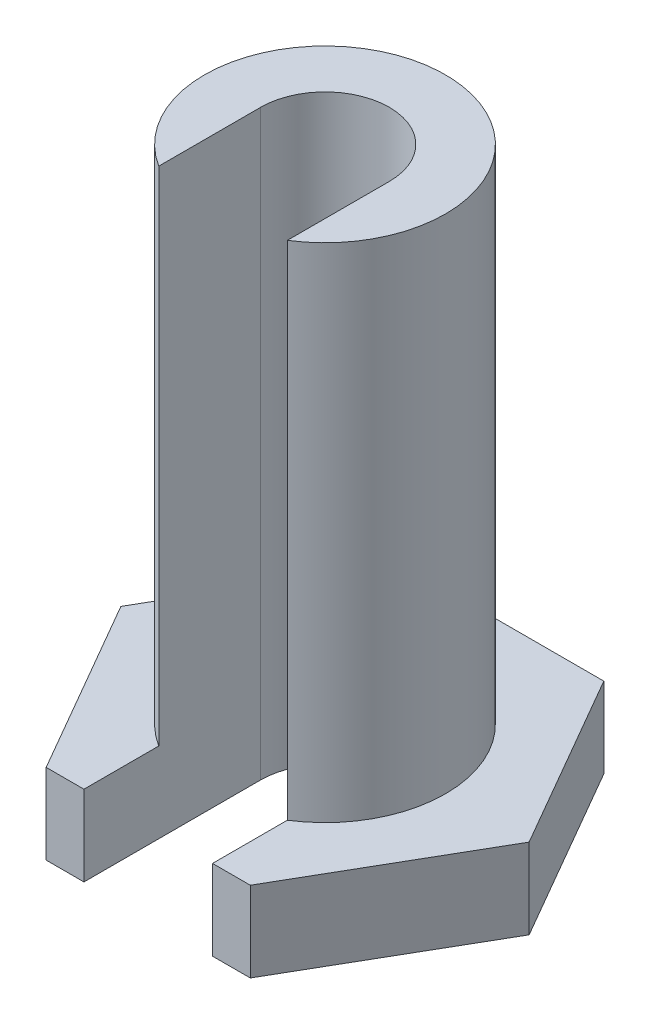
ISO-10303-21;
HEADER;
FILE_DESCRIPTION(('STEP AP214'),'2;1');
FILE_NAME('part.step','',(''),(''),'','','');
FILE_SCHEMA(('AUTOMOTIVE_DESIGN { 1 0 10303 214 1 1 1 1 }'));
ENDSEC;
DATA;
#1=APPLICATION_CONTEXT('core data for automotive mechanical design processes');
#2=APPLICATION_PROTOCOL_DEFINITION('international standard','automotive_design',2000,#1);
#3=PRODUCT_CONTEXT('',#1,'mechanical');
#4=PRODUCT('Part','Part','',(#3));
#5=PRODUCT_RELATED_PRODUCT_CATEGORY('part','',(#4));
#6=PRODUCT_DEFINITION_FORMATION('','',#4);
#7=PRODUCT_DEFINITION_CONTEXT('part definition',#1,'design');
#8=PRODUCT_DEFINITION('design','',#6,#7);
#9=PRODUCT_DEFINITION_SHAPE('','',#8);
#10=(LENGTH_UNIT() NAMED_UNIT(*) SI_UNIT(.MILLI.,.METRE.));
#11=(NAMED_UNIT(*) PLANE_ANGLE_UNIT() SI_UNIT($,.RADIAN.));
#12=(NAMED_UNIT(*) SI_UNIT($,.STERADIAN.) SOLID_ANGLE_UNIT());
#13=UNCERTAINTY_MEASURE_WITH_UNIT(LENGTH_MEASURE(1.E-05),#10,'distance_accuracy_value','');
#14=(GEOMETRIC_REPRESENTATION_CONTEXT(3) GLOBAL_UNCERTAINTY_ASSIGNED_CONTEXT((#13)) GLOBAL_UNIT_ASSIGNED_CONTEXT((#10,
#11,#12)) REPRESENTATION_CONTEXT('',''));
#15=CARTESIAN_POINT('',(0.,0.,0.));
#16=DIRECTION('',(0.,0.,1.));
#17=DIRECTION('',(1.,0.,0.));
#18=AXIS2_PLACEMENT_3D('',#15,#16,#17);
#19=CARTESIAN_POINT('',(2.54034118443435,2.,4.4));
#20=DIRECTION('',(0.,0.,1.));
#21=DIRECTION('',(1.,0.,0.));
#22=AXIS2_PLACEMENT_3D('',#19,#20,#21);
#23=PLANE('',#22);
#24=DIRECTION('',(0.,1.,0.));
#25=VECTOR('',#24,1.);
#26=CARTESIAN_POINT('',(1.6,0.,4.4));
#27=LINE('',#26,#25);
#28=CARTESIAN_POINT('',(1.6,0.,4.4));
#29=VERTEX_POINT('',#28);
#30=CARTESIAN_POINT('',(1.6,2.,4.4));
#31=VERTEX_POINT('',#30);
#32=EDGE_CURVE('E224',#29,#31,#27,.T.);
#33=ORIENTED_EDGE('',*,*,#32,.F.);
#34=DIRECTION('',(-1.,0.,0.));
#35=VECTOR('',#34,1.);
#36=CARTESIAN_POINT('',(2.54034118443435,0.,4.4));
#37=LINE('',#36,#35);
#38=CARTESIAN_POINT('',(2.54034118443435,0.,4.4));
#39=VERTEX_POINT('',#38);
#40=EDGE_CURVE('E144',#39,#29,#37,.T.);
#41=ORIENTED_EDGE('',*,*,#40,.F.);
#42=DIRECTION('',(0.,-1.,0.));
#43=VECTOR('',#42,1.);
#44=CARTESIAN_POINT('',(2.54034118443435,2.,4.4));
#45=LINE('',#44,#43);
#46=CARTESIAN_POINT('',(2.54034118443435,2.,4.4));
#47=VERTEX_POINT('',#46);
#48=EDGE_CURVE('E128',#47,#39,#45,.T.);
#49=ORIENTED_EDGE('',*,*,#48,.F.);
#50=DIRECTION('',(-1.,0.,0.));
#51=VECTOR('',#50,1.);
#52=CARTESIAN_POINT('',(2.54034118443435,2.,4.4));
#53=LINE('',#52,#51);
#54=EDGE_CURVE('E164',#47,#31,#53,.T.);
#55=ORIENTED_EDGE('',*,*,#54,.T.);
#56=EDGE_LOOP('',(#33,#41,#49,#55));
#57=FACE_BOUND('',#56,.T.);
#58=ADVANCED_FACE('F34',(#57),#23,.T.);
#59=CARTESIAN_POINT('',(0.,14.5,0.));
#60=DIRECTION('',(0.,-1.,0.));
#61=DIRECTION('',(0.,0.,-1.));
#62=AXIS2_PLACEMENT_3D('',#59,#60,#61);
#63=CYLINDRICAL_SURFACE('',#62,3.);
#64=CARTESIAN_POINT('',(0.,14.5,0.));
#65=DIRECTION('',(0.,1.,0.));
#66=DIRECTION('',(0.,0.,1.));
#67=AXIS2_PLACEMENT_3D('',#64,#65,#66);
#68=CIRCLE('',#67,3.);
#69=CARTESIAN_POINT('',(1.6,14.5,2.53771550808991));
#70=VERTEX_POINT('',#69);
#71=CARTESIAN_POINT('',(-1.6,14.5,2.53771550808991));
#72=VERTEX_POINT('',#71);
#73=EDGE_CURVE('E44',#70,#72,#68,.T.);
#74=ORIENTED_EDGE('',*,*,#73,.F.);
#75=DIRECTION('',(0.,-1.,0.));
#76=VECTOR('',#75,1.);
#77=CARTESIAN_POINT('',(1.6,14.5,2.53771550808991));
#78=LINE('',#77,#76);
#79=CARTESIAN_POINT('',(1.6,2.,2.53771550808991));
#80=VERTEX_POINT('',#79);
#81=EDGE_CURVE('E193',#70,#80,#78,.T.);
#82=ORIENTED_EDGE('',*,*,#81,.T.);
#83=CARTESIAN_POINT('',(0.,2.,0.));
#84=DIRECTION('',(0.,-1.,0.));
#85=DIRECTION('',(0.,0.,-1.));
#86=AXIS2_PLACEMENT_3D('',#83,#84,#85);
#87=CIRCLE('',#86,3.);
#88=CARTESIAN_POINT('',(-1.6,2.,2.53771550808991));
#89=VERTEX_POINT('',#88);
#90=EDGE_CURVE('E11',#89,#80,#87,.T.);
#91=ORIENTED_EDGE('',*,*,#90,.F.);
#92=DIRECTION('',(0.,-1.,0.));
#93=VECTOR('',#92,1.);
#94=CARTESIAN_POINT('',(-1.6,14.5,2.53771550808991));
#95=LINE('',#94,#93);
#96=EDGE_CURVE('E194',#89,#72,#95,.F.);
#97=ORIENTED_EDGE('',*,*,#96,.T.);
#98=EDGE_LOOP('',(#74,#82,#91,#97));
#99=FACE_BOUND('',#98,.T.);
#100=ADVANCED_FACE('F36',(#99),#63,.T.);
#101=CARTESIAN_POINT('',(0.,14.5,0.));
#102=DIRECTION('',(0.,1.,0.));
#103=DIRECTION('',(0.,0.,1.));
#104=AXIS2_PLACEMENT_3D('',#101,#102,#103);
#105=PLANE('',#104);
#106=DIRECTION('',(0.,0.,-1.));
#107=VECTOR('',#106,1.);
#108=CARTESIAN_POINT('',(1.6,14.5,0.));
#109=LINE('',#108,#107);
#110=CARTESIAN_POINT('',(1.6,14.5,0.));
#111=VERTEX_POINT('',#110);
#112=EDGE_CURVE('E66',#70,#111,#109,.T.);
#113=ORIENTED_EDGE('',*,*,#112,.F.);
#114=ORIENTED_EDGE('',*,*,#73,.T.);
#115=DIRECTION('',(0.,0.,1.));
#116=VECTOR('',#115,1.);
#117=CARTESIAN_POINT('',(-1.6,14.5,0.));
#118=LINE('',#117,#116);
#119=CARTESIAN_POINT('',(-1.6,14.5,0.));
#120=VERTEX_POINT('',#119);
#121=EDGE_CURVE('E188',#120,#72,#118,.T.);
#122=ORIENTED_EDGE('',*,*,#121,.F.);
#123=CARTESIAN_POINT('',(0.,14.5,0.));
#124=DIRECTION('',(0.,1.,0.));
#125=DIRECTION('',(0.,0.,1.));
#126=AXIS2_PLACEMENT_3D('',#123,#124,#125);
#127=CIRCLE('',#126,1.6);
#128=EDGE_CURVE('E38',#111,#120,#127,.T.);
#129=ORIENTED_EDGE('',*,*,#128,.F.);
#130=EDGE_LOOP('',(#113,#114,#122,#129));
#131=FACE_BOUND('',#130,.T.);
#132=ADVANCED_FACE('F186',(#131),#105,.T.);
#133=CARTESIAN_POINT('',(-2.54034118443435,2.,4.4));
#134=DIRECTION('',(-0.866025403784439,0.,0.5));
#135=DIRECTION('',(0.5,0.,0.866025403784439));
#136=AXIS2_PLACEMENT_3D('',#133,#134,#135);
#137=PLANE('',#136);
#138=DIRECTION('',(-0.5,0.,-0.866025403784439));
#139=VECTOR('',#138,1.);
#140=CARTESIAN_POINT('',(-2.54034118443435,0.,4.4));
#141=LINE('',#140,#139);
#142=CARTESIAN_POINT('',(-2.54034118443435,0.,4.4));
#143=VERTEX_POINT('',#142);
#144=CARTESIAN_POINT('',(-5.0806823688687,0.,0.));
#145=VERTEX_POINT('',#144);
#146=EDGE_CURVE('E140',#143,#145,#141,.T.);
#147=ORIENTED_EDGE('',*,*,#146,.F.);
#148=DIRECTION('',(0.,-1.,0.));
#149=VECTOR('',#148,1.);
#150=CARTESIAN_POINT('',(-2.54034118443435,2.,4.4));
#151=LINE('',#150,#149);
#152=CARTESIAN_POINT('',(-2.54034118443435,2.,4.4));
#153=VERTEX_POINT('',#152);
#154=EDGE_CURVE('E148',#153,#143,#151,.T.);
#155=ORIENTED_EDGE('',*,*,#154,.F.);
#156=DIRECTION('',(-0.5,0.,-0.866025403784439));
#157=VECTOR('',#156,1.);
#158=CARTESIAN_POINT('',(-2.54034118443435,2.,4.4));
#159=LINE('',#158,#157);
#160=CARTESIAN_POINT('',(-5.0806823688687,2.,0.));
#161=VERTEX_POINT('',#160);
#162=EDGE_CURVE('E172',#153,#161,#159,.T.);
#163=ORIENTED_EDGE('',*,*,#162,.T.);
#164=DIRECTION('',(0.,-1.,0.));
#165=VECTOR('',#164,1.);
#166=CARTESIAN_POINT('',(-5.0806823688687,2.,0.));
#167=LINE('',#166,#165);
#168=EDGE_CURVE('E157',#161,#145,#167,.T.);
#169=ORIENTED_EDGE('',*,*,#168,.T.);
#170=EDGE_LOOP('',(#147,#155,#163,#169));
#171=FACE_BOUND('',#170,.T.);
#172=ADVANCED_FACE('F156',(#171),#137,.T.);
#173=DIRECTION('',(0.,1.,0.));
#174=VECTOR('',#173,1.);
#175=CARTESIAN_POINT('',(-1.6,0.,4.4));
#176=LINE('',#175,#174);
#177=CARTESIAN_POINT('',(-1.6,0.,4.4));
#178=VERTEX_POINT('',#177);
#179=CARTESIAN_POINT('',(-1.6,2.,4.4));
#180=VERTEX_POINT('',#179);
#181=EDGE_CURVE('E52',#178,#180,#176,.T.);
#182=ORIENTED_EDGE('',*,*,#181,.T.);
#183=EDGE_CURVE('E151',#180,#153,#53,.T.);
#184=ORIENTED_EDGE('',*,*,#183,.T.);
#185=ORIENTED_EDGE('',*,*,#154,.T.);
#186=EDGE_CURVE('E134',#178,#143,#37,.T.);
#187=ORIENTED_EDGE('',*,*,#186,.F.);
#188=EDGE_LOOP('',(#182,#184,#185,#187));
#189=FACE_BOUND('',#188,.T.);
#190=ADVANCED_FACE('F149',(#189),#23,.T.);
#191=CARTESIAN_POINT('',(5.08068236886871,2.,0.));
#192=DIRECTION('',(0.866025403784439,0.,0.5));
#193=DIRECTION('',(0.5,0.,-0.866025403784439));
#194=AXIS2_PLACEMENT_3D('',#191,#192,#193);
#195=PLANE('',#194);
#196=DIRECTION('',(-0.5,0.,0.866025403784439));
#197=VECTOR('',#196,1.);
#198=CARTESIAN_POINT('',(5.08068236886871,0.,0.));
#199=LINE('',#198,#197);
#200=CARTESIAN_POINT('',(5.08068236886871,0.,0.));
#201=VERTEX_POINT('',#200);
#202=EDGE_CURVE('E145',#201,#39,#199,.T.);
#203=ORIENTED_EDGE('',*,*,#202,.F.);
#204=DIRECTION('',(0.,-1.,0.));
#205=VECTOR('',#204,1.);
#206=CARTESIAN_POINT('',(5.08068236886871,2.,0.));
#207=LINE('',#206,#205);
#208=CARTESIAN_POINT('',(5.08068236886871,2.,0.));
#209=VERTEX_POINT('',#208);
#210=EDGE_CURVE('E175',#209,#201,#207,.T.);
#211=ORIENTED_EDGE('',*,*,#210,.F.);
#212=DIRECTION('',(-0.5,0.,0.866025403784439));
#213=VECTOR('',#212,1.);
#214=CARTESIAN_POINT('',(5.08068236886871,2.,0.));
#215=LINE('',#214,#213);
#216=EDGE_CURVE('E217',#209,#47,#215,.T.);
#217=ORIENTED_EDGE('',*,*,#216,.T.);
#218=ORIENTED_EDGE('',*,*,#48,.T.);
#219=EDGE_LOOP('',(#203,#211,#217,#218));
#220=FACE_BOUND('',#219,.T.);
#221=ADVANCED_FACE('F256',(#220),#195,.T.);
#222=CARTESIAN_POINT('',(2.54034118443435,2.,-4.4));
#223=DIRECTION('',(0.866025403784439,0.,-0.5));
#224=DIRECTION('',(-0.5,0.,-0.866025403784439));
#225=AXIS2_PLACEMENT_3D('',#222,#223,#224);
#226=PLANE('',#225);
#227=DIRECTION('',(0.5,0.,0.866025403784439));
#228=VECTOR('',#227,1.);
#229=CARTESIAN_POINT('',(2.54034118443435,0.,-4.4));
#230=LINE('',#229,#228);
#231=CARTESIAN_POINT('',(2.54034118443435,0.,-4.4));
#232=VERTEX_POINT('',#231);
#233=EDGE_CURVE('E169',#232,#201,#230,.T.);
#234=ORIENTED_EDGE('',*,*,#233,.F.);
#235=DIRECTION('',(0.,-1.,0.));
#236=VECTOR('',#235,1.);
#237=CARTESIAN_POINT('',(2.54034118443435,2.,-4.4));
#238=LINE('',#237,#236);
#239=CARTESIAN_POINT('',(2.54034118443435,2.,-4.4));
#240=VERTEX_POINT('',#239);
#241=EDGE_CURVE('E177',#240,#232,#238,.T.);
#242=ORIENTED_EDGE('',*,*,#241,.F.);
#243=DIRECTION('',(0.5,0.,0.866025403784439));
#244=VECTOR('',#243,1.);
#245=CARTESIAN_POINT('',(2.54034118443435,2.,-4.4));
#246=LINE('',#245,#244);
#247=EDGE_CURVE('E215',#240,#209,#246,.T.);
#248=ORIENTED_EDGE('',*,*,#247,.T.);
#249=ORIENTED_EDGE('',*,*,#210,.T.);
#250=EDGE_LOOP('',(#234,#242,#248,#249));
#251=FACE_BOUND('',#250,.T.);
#252=ADVANCED_FACE('F261',(#251),#226,.T.);
#253=CARTESIAN_POINT('',(-2.54034118443435,2.,-4.4));
#254=DIRECTION('',(0.,0.,-1.));
#255=DIRECTION('',(-1.,0.,0.));
#256=AXIS2_PLACEMENT_3D('',#253,#254,#255);
#257=PLANE('',#256);
#258=DIRECTION('',(1.,0.,0.));
#259=VECTOR('',#258,1.);
#260=CARTESIAN_POINT('',(-2.54034118443435,0.,-4.4));
#261=LINE('',#260,#259);
#262=CARTESIAN_POINT('',(-2.54034118443435,0.,-4.4));
#263=VERTEX_POINT('',#262);
#264=EDGE_CURVE('E161',#263,#232,#261,.T.);
#265=ORIENTED_EDGE('',*,*,#264,.F.);
#266=DIRECTION('',(0.,-1.,0.));
#267=VECTOR('',#266,1.);
#268=CARTESIAN_POINT('',(-2.54034118443435,2.,-4.4));
#269=LINE('',#268,#267);
#270=CARTESIAN_POINT('',(-2.54034118443435,2.,-4.4));
#271=VERTEX_POINT('',#270);
#272=EDGE_CURVE('E179',#271,#263,#269,.T.);
#273=ORIENTED_EDGE('',*,*,#272,.F.);
#274=DIRECTION('',(1.,0.,0.));
#275=VECTOR('',#274,1.);
#276=CARTESIAN_POINT('',(-2.54034118443435,2.,-4.4));
#277=LINE('',#276,#275);
#278=EDGE_CURVE('E212',#271,#240,#277,.T.);
#279=ORIENTED_EDGE('',*,*,#278,.T.);
#280=ORIENTED_EDGE('',*,*,#241,.T.);
#281=EDGE_LOOP('',(#265,#273,#279,#280));
#282=FACE_BOUND('',#281,.T.);
#283=ADVANCED_FACE('F271',(#282),#257,.T.);
#284=CARTESIAN_POINT('',(-5.0806823688687,2.,0.));
#285=DIRECTION('',(-0.866025403784439,0.,-0.5));
#286=DIRECTION('',(-0.5,0.,0.866025403784439));
#287=AXIS2_PLACEMENT_3D('',#284,#285,#286);
#288=PLANE('',#287);
#289=DIRECTION('',(0.5,0.,-0.866025403784439));
#290=VECTOR('',#289,1.);
#291=CARTESIAN_POINT('',(-5.0806823688687,0.,0.));
#292=LINE('',#291,#290);
#293=EDGE_CURVE('E159',#145,#263,#292,.T.);
#294=ORIENTED_EDGE('',*,*,#293,.F.);
#295=ORIENTED_EDGE('',*,*,#168,.F.);
#296=DIRECTION('',(0.5,0.,-0.866025403784439));
#297=VECTOR('',#296,1.);
#298=CARTESIAN_POINT('',(-5.0806823688687,2.,0.));
#299=LINE('',#298,#297);
#300=EDGE_CURVE('E209',#161,#271,#299,.T.);
#301=ORIENTED_EDGE('',*,*,#300,.T.);
#302=ORIENTED_EDGE('',*,*,#272,.T.);
#303=EDGE_LOOP('',(#294,#295,#301,#302));
#304=FACE_BOUND('',#303,.T.);
#305=ADVANCED_FACE('F268',(#304),#288,.T.);
#306=CARTESIAN_POINT('',(0.,2.,0.));
#307=DIRECTION('',(0.,-1.,0.));
#308=DIRECTION('',(0.,0.,-1.));
#309=AXIS2_PLACEMENT_3D('',#306,#307,#308);
#310=PLANE('',#309);
#311=ORIENTED_EDGE('',*,*,#90,.T.);
#312=DIRECTION('',(0.,0.,1.));
#313=VECTOR('',#312,1.);
#314=CARTESIAN_POINT('',(1.6,2.,0.));
#315=LINE('',#314,#313);
#316=EDGE_CURVE('E198',#80,#31,#315,.T.);
#317=ORIENTED_EDGE('',*,*,#316,.T.);
#318=ORIENTED_EDGE('',*,*,#54,.F.);
#319=ORIENTED_EDGE('',*,*,#216,.F.);
#320=ORIENTED_EDGE('',*,*,#247,.F.);
#321=ORIENTED_EDGE('',*,*,#278,.F.);
#322=ORIENTED_EDGE('',*,*,#300,.F.);
#323=ORIENTED_EDGE('',*,*,#162,.F.);
#324=ORIENTED_EDGE('',*,*,#183,.F.);
#325=DIRECTION('',(0.,0.,-1.));
#326=VECTOR('',#325,1.);
#327=CARTESIAN_POINT('',(-1.6,2.,0.));
#328=LINE('',#327,#326);
#329=EDGE_CURVE('E196',#180,#89,#328,.T.);
#330=ORIENTED_EDGE('',*,*,#329,.T.);
#331=EDGE_LOOP('',(#311,#317,#318,#319,#320,#321,#322,#323,#324,#330));
#332=FACE_BOUND('',#331,.T.);
#333=ADVANCED_FACE('F226',(#332),#310,.F.);
#334=CARTESIAN_POINT('',(0.,0.,0.));
#335=DIRECTION('',(0.,1.,0.));
#336=DIRECTION('',(0.,0.,1.));
#337=AXIS2_PLACEMENT_3D('',#334,#335,#336);
#338=PLANE('',#337);
#339=ORIENTED_EDGE('',*,*,#40,.T.);
#340=DIRECTION('',(0.,0.,-1.));
#341=VECTOR('',#340,1.);
#342=CARTESIAN_POINT('',(1.6,0.,4.4));
#343=LINE('',#342,#341);
#344=CARTESIAN_POINT('',(1.6,0.,0.));
#345=VERTEX_POINT('',#344);
#346=EDGE_CURVE('E230',#29,#345,#343,.T.);
#347=ORIENTED_EDGE('',*,*,#346,.T.);
#348=CARTESIAN_POINT('',(0.,0.,0.));
#349=DIRECTION('',(0.,1.,0.));
#350=DIRECTION('',(0.,0.,1.));
#351=AXIS2_PLACEMENT_3D('',#348,#349,#350);
#352=CIRCLE('',#351,1.6);
#353=CARTESIAN_POINT('',(-1.6,0.,0.));
#354=VERTEX_POINT('',#353);
#355=EDGE_CURVE('E236',#345,#354,#352,.T.);
#356=ORIENTED_EDGE('',*,*,#355,.T.);
#357=DIRECTION('',(0.,0.,1.));
#358=VECTOR('',#357,1.);
#359=CARTESIAN_POINT('',(-1.6,0.,0.));
#360=LINE('',#359,#358);
#361=EDGE_CURVE('E142',#354,#178,#360,.T.);
#362=ORIENTED_EDGE('',*,*,#361,.T.);
#363=ORIENTED_EDGE('',*,*,#186,.T.);
#364=ORIENTED_EDGE('',*,*,#146,.T.);
#365=ORIENTED_EDGE('',*,*,#293,.T.);
#366=ORIENTED_EDGE('',*,*,#264,.T.);
#367=ORIENTED_EDGE('',*,*,#233,.T.);
#368=ORIENTED_EDGE('',*,*,#202,.T.);
#369=EDGE_LOOP('',(#339,#347,#356,#362,#363,#364,#365,#366,#367,#368));
#370=FACE_BOUND('',#369,.T.);
#371=ADVANCED_FACE('F137',(#370),#338,.F.);
#372=CARTESIAN_POINT('',(0.,0.,0.));
#373=DIRECTION('',(0.,1.,0.));
#374=DIRECTION('',(0.,0.,1.));
#375=AXIS2_PLACEMENT_3D('',#372,#373,#374);
#376=CYLINDRICAL_SURFACE('',#375,1.6);
#377=ORIENTED_EDGE('',*,*,#128,.T.);
#378=DIRECTION('',(0.,1.,0.));
#379=VECTOR('',#378,1.);
#380=CARTESIAN_POINT('',(-1.6,0.,0.));
#381=LINE('',#380,#379);
#382=EDGE_CURVE('E72',#354,#120,#381,.T.);
#383=ORIENTED_EDGE('',*,*,#382,.F.);
#384=ORIENTED_EDGE('',*,*,#355,.F.);
#385=DIRECTION('',(0.,1.,0.));
#386=VECTOR('',#385,1.);
#387=CARTESIAN_POINT('',(1.6,0.,0.));
#388=LINE('',#387,#386);
#389=EDGE_CURVE('E200',#345,#111,#388,.T.);
#390=ORIENTED_EDGE('',*,*,#389,.T.);
#391=EDGE_LOOP('',(#377,#383,#384,#390));
#392=FACE_BOUND('',#391,.T.);
#393=ADVANCED_FACE('F238',(#392),#376,.F.);
#394=CARTESIAN_POINT('',(1.6,0.,4.4));
#395=DIRECTION('',(1.,0.,0.));
#396=DIRECTION('',(0.,0.,-1.));
#397=AXIS2_PLACEMENT_3D('',#394,#395,#396);
#398=PLANE('',#397);
#399=ORIENTED_EDGE('',*,*,#112,.T.);
#400=ORIENTED_EDGE('',*,*,#389,.F.);
#401=ORIENTED_EDGE('',*,*,#346,.F.);
#402=ORIENTED_EDGE('',*,*,#32,.T.);
#403=ORIENTED_EDGE('',*,*,#316,.F.);
#404=ORIENTED_EDGE('',*,*,#81,.F.);
#405=EDGE_LOOP('',(#399,#400,#401,#402,#403,#404));
#406=FACE_BOUND('',#405,.T.);
#407=ADVANCED_FACE('F228',(#406),#398,.F.);
#408=CARTESIAN_POINT('',(-1.6,0.,0.));
#409=DIRECTION('',(-1.,0.,0.));
#410=DIRECTION('',(0.,0.,1.));
#411=AXIS2_PLACEMENT_3D('',#408,#409,#410);
#412=PLANE('',#411);
#413=ORIENTED_EDGE('',*,*,#121,.T.);
#414=ORIENTED_EDGE('',*,*,#96,.F.);
#415=ORIENTED_EDGE('',*,*,#329,.F.);
#416=ORIENTED_EDGE('',*,*,#181,.F.);
#417=ORIENTED_EDGE('',*,*,#361,.F.);
#418=ORIENTED_EDGE('',*,*,#382,.T.);
#419=EDGE_LOOP('',(#413,#414,#415,#416,#417,#418));
#420=FACE_BOUND('',#419,.T.);
#421=ADVANCED_FACE('F245',(#420),#412,.F.);
#422=CLOSED_SHELL('',(#58,#100,#132,#172,#190,#221,#252,#283,#305,#333,#371,#393,#407,#421));
#423=MANIFOLD_SOLID_BREP('B2',#422);
#424=ADVANCED_BREP_SHAPE_REPRESENTATION('',(#18,#423),#14);
#425=SHAPE_DEFINITION_REPRESENTATION(#9,#424);
ENDSEC;
END-ISO-10303-21;
